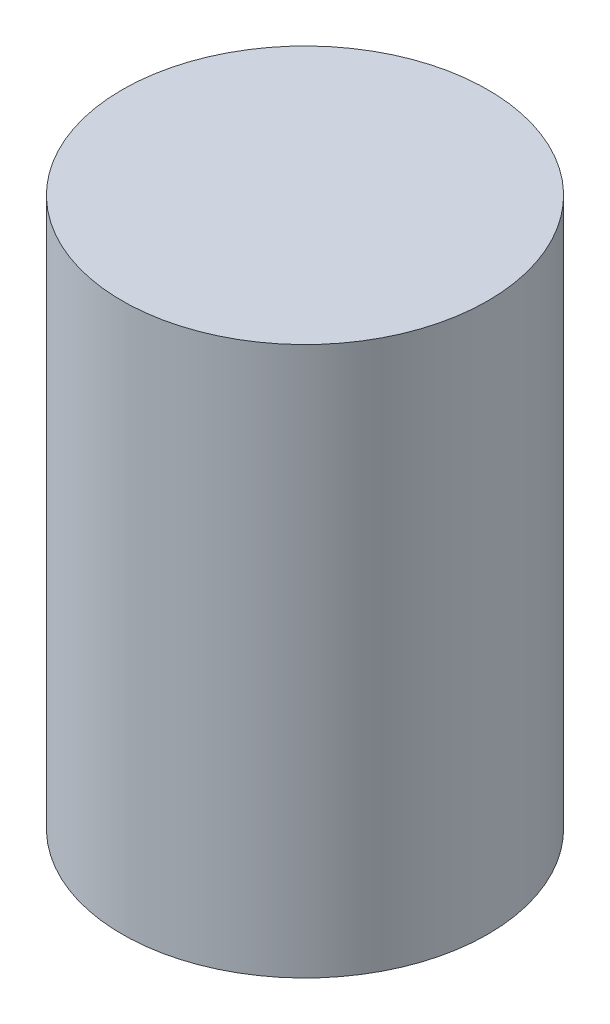
ISO-10303-21;
HEADER;
FILE_DESCRIPTION(('STEP AP214'),'2;1');
FILE_NAME('part.step','',(''),(''),'','','');
FILE_SCHEMA(('AUTOMOTIVE_DESIGN { 1 0 10303 214 1 1 1 1 }'));
ENDSEC;
DATA;
#1=APPLICATION_CONTEXT('core data for automotive mechanical design processes');
#2=APPLICATION_PROTOCOL_DEFINITION('international standard','automotive_design',2000,#1);
#3=PRODUCT_CONTEXT('',#1,'mechanical');
#4=PRODUCT('Part','Part','',(#3));
#5=PRODUCT_RELATED_PRODUCT_CATEGORY('part','',(#4));
#6=PRODUCT_DEFINITION_FORMATION('','',#4);
#7=PRODUCT_DEFINITION_CONTEXT('part definition',#1,'design');
#8=PRODUCT_DEFINITION('design','',#6,#7);
#9=PRODUCT_DEFINITION_SHAPE('','',#8);
#10=(LENGTH_UNIT() NAMED_UNIT(*) SI_UNIT(.MILLI.,.METRE.));
#11=(NAMED_UNIT(*) PLANE_ANGLE_UNIT() SI_UNIT($,.RADIAN.));
#12=(NAMED_UNIT(*) SI_UNIT($,.STERADIAN.) SOLID_ANGLE_UNIT());
#13=UNCERTAINTY_MEASURE_WITH_UNIT(LENGTH_MEASURE(1.E-05),#10,'distance_accuracy_value','');
#14=(GEOMETRIC_REPRESENTATION_CONTEXT(3) GLOBAL_UNCERTAINTY_ASSIGNED_CONTEXT((#13)) GLOBAL_UNIT_ASSIGNED_CONTEXT((#10,
#11,#12)) REPRESENTATION_CONTEXT('',''));
#15=CARTESIAN_POINT('',(0.,0.,0.));
#16=DIRECTION('',(0.,0.,1.));
#17=DIRECTION('',(1.,0.,0.));
#18=AXIS2_PLACEMENT_3D('',#15,#16,#17);
#19=CARTESIAN_POINT('',(3.60822483003176E-13,-2250.,0.));
#20=DIRECTION('',(0.,1.,0.));
#21=DIRECTION('',(-1.,0.,0.));
#22=AXIS2_PLACEMENT_3D('',#19,#20,#21);
#23=PLANE('',#22);
#24=CARTESIAN_POINT('',(3.60822483003176E-13,-2250.,0.));
#25=DIRECTION('',(0.,1.,0.));
#26=DIRECTION('',(-1.,0.,0.));
#27=AXIS2_PLACEMENT_3D('',#24,#25,#26);
#28=CIRCLE('',#27,1000.);
#29=CARTESIAN_POINT('',(-1000.,-2250.,0.));
#30=VERTEX_POINT('',#29);
#31=EDGE_CURVE('E10',#30,#30,#28,.T.);
#32=ORIENTED_EDGE('',*,*,#31,.F.);
#33=EDGE_LOOP('',(#32));
#34=FACE_BOUND('',#33,.T.);
#35=ADVANCED_FACE('F41',(#34),#23,.F.);
#36=CARTESIAN_POINT('',(0.,750.,0.));
#37=DIRECTION('',(0.,1.,0.));
#38=DIRECTION('',(-1.,0.,0.));
#39=AXIS2_PLACEMENT_3D('',#36,#37,#38);
#40=CYLINDRICAL_SURFACE('',#39,1000.);
#41=CARTESIAN_POINT('',(0.,750.,0.));
#42=DIRECTION('',(0.,1.,0.));
#43=DIRECTION('',(-1.,0.,0.));
#44=AXIS2_PLACEMENT_3D('',#41,#42,#43);
#45=CIRCLE('',#44,1000.);
#46=CARTESIAN_POINT('',(-1000.,750.,0.));
#47=VERTEX_POINT('',#46);
#48=EDGE_CURVE('E48',#47,#47,#45,.T.);
#49=ORIENTED_EDGE('',*,*,#48,.F.);
#50=EDGE_LOOP('',(#49));
#51=FACE_BOUND('',#50,.T.);
#52=ORIENTED_EDGE('',*,*,#31,.T.);
#53=EDGE_LOOP('',(#52));
#54=FACE_BOUND('',#53,.T.);
#55=ADVANCED_FACE('F57',(#51,#54),#40,.T.);
#56=CARTESIAN_POINT('',(0.,750.,0.));
#57=DIRECTION('',(0.,-1.,0.));
#58=DIRECTION('',(1.,0.,0.));
#59=AXIS2_PLACEMENT_3D('',#56,#57,#58);
#60=PLANE('',#59);
#61=ORIENTED_EDGE('',*,*,#48,.T.);
#62=EDGE_LOOP('',(#61));
#63=FACE_BOUND('',#62,.T.);
#64=ADVANCED_FACE('F55',(#63),#60,.F.);
#65=CLOSED_SHELL('',(#35,#55,#64));
#66=MANIFOLD_SOLID_BREP('B2',#65);
#67=ADVANCED_BREP_SHAPE_REPRESENTATION('',(#18,#66),#14);
#68=SHAPE_DEFINITION_REPRESENTATION(#9,#67);
ENDSEC;
END-ISO-10303-21;
